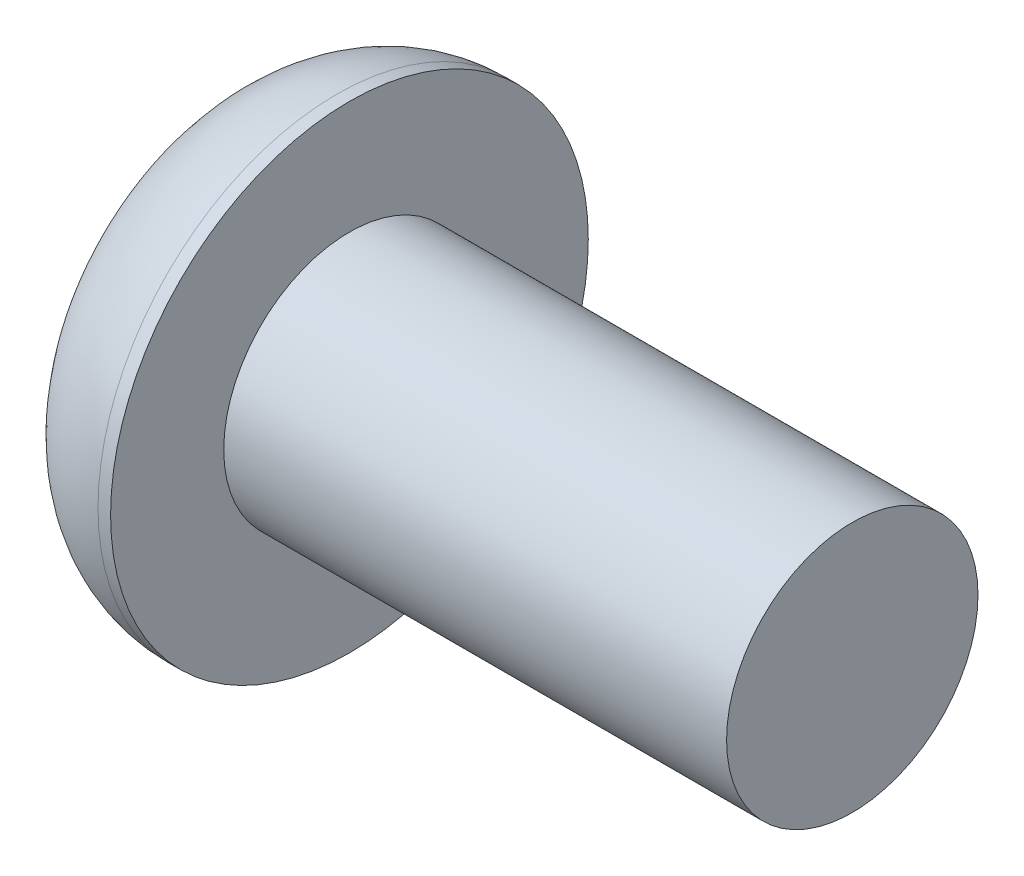
ISO-10303-21;
HEADER;
FILE_DESCRIPTION(('STEP AP214'),'2;1');
FILE_NAME('part.step','',(''),(''),'','','');
FILE_SCHEMA(('AUTOMOTIVE_DESIGN { 1 0 10303 214 1 1 1 1 }'));
ENDSEC;
DATA;
#1=APPLICATION_CONTEXT('core data for automotive mechanical design processes');
#2=APPLICATION_PROTOCOL_DEFINITION('international standard','automotive_design',2000,#1);
#3=PRODUCT_CONTEXT('',#1,'mechanical');
#4=PRODUCT('Part','Part','',(#3));
#5=PRODUCT_RELATED_PRODUCT_CATEGORY('part','',(#4));
#6=PRODUCT_DEFINITION_FORMATION('','',#4);
#7=PRODUCT_DEFINITION_CONTEXT('part definition',#1,'design');
#8=PRODUCT_DEFINITION('design','',#6,#7);
#9=PRODUCT_DEFINITION_SHAPE('','',#8);
#10=(LENGTH_UNIT() NAMED_UNIT(*) SI_UNIT(.MILLI.,.METRE.));
#11=(NAMED_UNIT(*) PLANE_ANGLE_UNIT() SI_UNIT($,.RADIAN.));
#12=(NAMED_UNIT(*) SI_UNIT($,.STERADIAN.) SOLID_ANGLE_UNIT());
#13=UNCERTAINTY_MEASURE_WITH_UNIT(LENGTH_MEASURE(1.E-05),#10,'distance_accuracy_value','');
#14=(GEOMETRIC_REPRESENTATION_CONTEXT(3) GLOBAL_UNCERTAINTY_ASSIGNED_CONTEXT((#13)) GLOBAL_UNIT_ASSIGNED_CONTEXT((#10,
#11,#12)) REPRESENTATION_CONTEXT('',''));
#15=CARTESIAN_POINT('',(0.,0.,0.));
#16=DIRECTION('',(0.,0.,1.));
#17=DIRECTION('',(1.,0.,0.));
#18=AXIS2_PLACEMENT_3D('',#15,#16,#17);
#19=CARTESIAN_POINT('',(0.,0.,-1.34999999999999));
#20=DIRECTION('',(-1.,0.,0.));
#21=DIRECTION('',(0.,0.,1.));
#22=AXIS2_PLACEMENT_3D('',#19,#20,#21);
#23=PLANE('',#22);
#24=DIRECTION('',(0.,0.866025403784439,0.5));
#25=VECTOR('',#24,1.);
#26=CARTESIAN_POINT('',(0.,-1.,0.577350269189626));
#27=LINE('',#26,#25);
#28=CARTESIAN_POINT('',(0.,-1.,0.577350269189626));
#29=VERTEX_POINT('',#28);
#30=CARTESIAN_POINT('',(0.,0.,1.15470053837925));
#31=VERTEX_POINT('',#30);
#32=EDGE_CURVE('E47',#29,#31,#27,.T.);
#33=ORIENTED_EDGE('',*,*,#32,.F.);
#34=DIRECTION('',(0.,0.,1.));
#35=VECTOR('',#34,1.);
#36=CARTESIAN_POINT('',(0.,-1.,-0.577350269189626));
#37=LINE('',#36,#35);
#38=CARTESIAN_POINT('',(0.,-1.,-0.577350269189626));
#39=VERTEX_POINT('',#38);
#40=EDGE_CURVE('E130',#39,#29,#37,.T.);
#41=ORIENTED_EDGE('',*,*,#40,.F.);
#42=DIRECTION('',(0.,-0.866025403784439,0.5));
#43=VECTOR('',#42,1.);
#44=CARTESIAN_POINT('',(0.,0.,-1.15470053837925));
#45=LINE('',#44,#43);
#46=CARTESIAN_POINT('',(0.,0.,-1.15470053837925));
#47=VERTEX_POINT('',#46);
#48=EDGE_CURVE('E128',#47,#39,#45,.T.);
#49=ORIENTED_EDGE('',*,*,#48,.F.);
#50=DIRECTION('',(0.,-0.866025403784439,-0.5));
#51=VECTOR('',#50,1.);
#52=CARTESIAN_POINT('',(0.,1.,-0.577350269189626));
#53=LINE('',#52,#51);
#54=CARTESIAN_POINT('',(0.,1.,-0.577350269189626));
#55=VERTEX_POINT('',#54);
#56=EDGE_CURVE('E95',#55,#47,#53,.T.);
#57=ORIENTED_EDGE('',*,*,#56,.F.);
#58=DIRECTION('',(0.,0.,-1.));
#59=VECTOR('',#58,1.);
#60=CARTESIAN_POINT('',(0.,1.,0.577350269189625));
#61=LINE('',#60,#59);
#62=CARTESIAN_POINT('',(0.,1.,0.577350269189625));
#63=VERTEX_POINT('',#62);
#64=EDGE_CURVE('E124',#63,#55,#61,.T.);
#65=ORIENTED_EDGE('',*,*,#64,.F.);
#66=DIRECTION('',(0.,0.866025403784439,-0.5));
#67=VECTOR('',#66,1.);
#68=CARTESIAN_POINT('',(0.,0.,1.15470053837925));
#69=LINE('',#68,#67);
#70=EDGE_CURVE('E121',#31,#63,#69,.T.);
#71=ORIENTED_EDGE('',*,*,#70,.F.);
#72=EDGE_LOOP('',(#33,#41,#49,#57,#65,#71));
#73=FACE_BOUND('',#72,.T.);
#74=CARTESIAN_POINT('',(0.,0.,0.));
#75=DIRECTION('',(1.,0.,0.));
#76=DIRECTION('',(0.,0.,-1.));
#77=AXIS2_PLACEMENT_3D('',#74,#75,#76);
#78=CIRCLE('',#77,1.34999999999999);
#79=CARTESIAN_POINT('',(0.,0.,-1.34999999999999));
#80=VERTEX_POINT('',#79);
#81=EDGE_CURVE('E11',#80,#80,#78,.T.);
#82=ORIENTED_EDGE('',*,*,#81,.F.);
#83=EDGE_LOOP('',(#82));
#84=FACE_BOUND('',#83,.T.);
#85=ADVANCED_FACE('F33',(#73,#84),#23,.T.);
#86=CARTESIAN_POINT('',(1.5,0.,0.));
#87=DIRECTION('',(1.,0.,0.));
#88=DIRECTION('',(0.,0.,-1.));
#89=AXIS2_PLACEMENT_3D('',#86,#87,#88);
#90=DEGENERATE_TOROIDAL_SURFACE('',#89,1.35,1.5,.T.);
#91=ORIENTED_EDGE('',*,*,#81,.T.);
#92=EDGE_LOOP('',(#91));
#93=FACE_BOUND('',#92,.T.);
#94=CARTESIAN_POINT('',(1.50000000000001,0.,0.));
#95=DIRECTION('',(1.,0.,0.));
#96=DIRECTION('',(0.,0.,-1.));
#97=AXIS2_PLACEMENT_3D('',#94,#95,#96);
#98=CIRCLE('',#97,2.85);
#99=CARTESIAN_POINT('',(1.50000000000001,0.,-2.85));
#100=VERTEX_POINT('',#99);
#101=EDGE_CURVE('E40',#100,#100,#98,.T.);
#102=ORIENTED_EDGE('',*,*,#101,.F.);
#103=EDGE_LOOP('',(#102));
#104=FACE_BOUND('',#103,.T.);
#105=ADVANCED_FACE('F153',(#93,#104),#90,.T.);
#106=CARTESIAN_POINT('',(0.,0.,0.));
#107=DIRECTION('',(1.,0.,0.));
#108=DIRECTION('',(0.,0.,-1.));
#109=AXIS2_PLACEMENT_3D('',#106,#107,#108);
#110=CYLINDRICAL_SURFACE('',#109,2.85);
#111=ORIENTED_EDGE('',*,*,#101,.T.);
#112=EDGE_LOOP('',(#111));
#113=FACE_BOUND('',#112,.T.);
#114=CARTESIAN_POINT('',(1.65,0.,0.));
#115=DIRECTION('',(1.,0.,0.));
#116=DIRECTION('',(0.,0.,-1.));
#117=AXIS2_PLACEMENT_3D('',#114,#115,#116);
#118=CIRCLE('',#117,2.85);
#119=CARTESIAN_POINT('',(1.65,0.,-2.85));
#120=VERTEX_POINT('',#119);
#121=EDGE_CURVE('E145',#120,#120,#118,.T.);
#122=ORIENTED_EDGE('',*,*,#121,.F.);
#123=EDGE_LOOP('',(#122));
#124=FACE_BOUND('',#123,.T.);
#125=ADVANCED_FACE('F150',(#113,#124),#110,.T.);
#126=CARTESIAN_POINT('',(1.65,0.,-1.5));
#127=DIRECTION('',(1.,0.,0.));
#128=DIRECTION('',(0.,0.,-1.));
#129=AXIS2_PLACEMENT_3D('',#126,#127,#128);
#130=PLANE('',#129);
#131=ORIENTED_EDGE('',*,*,#121,.T.);
#132=EDGE_LOOP('',(#131));
#133=FACE_BOUND('',#132,.T.);
#134=CARTESIAN_POINT('',(1.65,0.,0.));
#135=DIRECTION('',(1.,0.,0.));
#136=DIRECTION('',(0.,0.,-1.));
#137=AXIS2_PLACEMENT_3D('',#134,#135,#136);
#138=CIRCLE('',#137,1.5);
#139=CARTESIAN_POINT('',(1.65,0.,-1.5));
#140=VERTEX_POINT('',#139);
#141=EDGE_CURVE('E142',#140,#140,#138,.T.);
#142=ORIENTED_EDGE('',*,*,#141,.F.);
#143=EDGE_LOOP('',(#142));
#144=FACE_BOUND('',#143,.T.);
#145=ADVANCED_FACE('F160',(#133,#144),#130,.T.);
#146=CARTESIAN_POINT('',(0.,0.,0.));
#147=DIRECTION('',(1.,0.,0.));
#148=DIRECTION('',(0.,0.,-1.));
#149=AXIS2_PLACEMENT_3D('',#146,#147,#148);
#150=CYLINDRICAL_SURFACE('',#149,1.5);
#151=ORIENTED_EDGE('',*,*,#141,.T.);
#152=EDGE_LOOP('',(#151));
#153=FACE_BOUND('',#152,.T.);
#154=CARTESIAN_POINT('',(7.65,0.,0.));
#155=DIRECTION('',(1.,0.,0.));
#156=DIRECTION('',(0.,0.,-1.));
#157=AXIS2_PLACEMENT_3D('',#154,#155,#156);
#158=CIRCLE('',#157,1.5);
#159=CARTESIAN_POINT('',(7.65,0.,-1.5));
#160=VERTEX_POINT('',#159);
#161=EDGE_CURVE('E134',#160,#160,#158,.T.);
#162=ORIENTED_EDGE('',*,*,#161,.F.);
#163=EDGE_LOOP('',(#162));
#164=FACE_BOUND('',#163,.T.);
#165=ADVANCED_FACE('F166',(#153,#164),#150,.T.);
#166=CARTESIAN_POINT('',(7.65,0.,0.));
#167=DIRECTION('',(1.,0.,0.));
#168=DIRECTION('',(0.,0.,-1.));
#169=AXIS2_PLACEMENT_3D('',#166,#167,#168);
#170=PLANE('',#169);
#171=ORIENTED_EDGE('',*,*,#161,.T.);
#172=EDGE_LOOP('',(#171));
#173=FACE_BOUND('',#172,.T.);
#174=ADVANCED_FACE('F170',(#173),#170,.T.);
#175=CARTESIAN_POINT('',(1.04,-1.,0.577350269189626));
#176=DIRECTION('',(0.,-0.5,0.866025403784439));
#177=DIRECTION('',(0.,-0.866025403784439,-0.5));
#178=AXIS2_PLACEMENT_3D('',#175,#176,#177);
#179=PLANE('',#178);
#180=ORIENTED_EDGE('',*,*,#32,.T.);
#181=DIRECTION('',(-1.,0.,0.));
#182=VECTOR('',#181,1.);
#183=CARTESIAN_POINT('',(1.04,0.,1.15470053837925));
#184=LINE('',#183,#182);
#185=CARTESIAN_POINT('',(1.04,0.,1.15470053837925));
#186=VERTEX_POINT('',#185);
#187=EDGE_CURVE('E77',#186,#31,#184,.T.);
#188=ORIENTED_EDGE('',*,*,#187,.F.);
#189=DIRECTION('',(0.,0.866025403784439,0.5));
#190=VECTOR('',#189,1.);
#191=CARTESIAN_POINT('',(1.04,-1.,0.577350269189626));
#192=LINE('',#191,#190);
#193=CARTESIAN_POINT('',(1.04,-1.,0.577350269189626));
#194=VERTEX_POINT('',#193);
#195=EDGE_CURVE('E132',#194,#186,#192,.T.);
#196=ORIENTED_EDGE('',*,*,#195,.F.);
#197=DIRECTION('',(-1.,0.,0.));
#198=VECTOR('',#197,1.);
#199=CARTESIAN_POINT('',(1.04,-1.,0.577350269189626));
#200=LINE('',#199,#198);
#201=EDGE_CURVE('E55',#194,#29,#200,.T.);
#202=ORIENTED_EDGE('',*,*,#201,.T.);
#203=EDGE_LOOP('',(#180,#188,#196,#202));
#204=FACE_BOUND('',#203,.T.);
#205=ADVANCED_FACE('F174',(#204),#179,.F.);
#206=CARTESIAN_POINT('',(1.04,-1.,-0.577350269189626));
#207=DIRECTION('',(0.,-1.,0.));
#208=DIRECTION('',(0.,0.,-1.));
#209=AXIS2_PLACEMENT_3D('',#206,#207,#208);
#210=PLANE('',#209);
#211=ORIENTED_EDGE('',*,*,#40,.T.);
#212=ORIENTED_EDGE('',*,*,#201,.F.);
#213=DIRECTION('',(0.,0.,1.));
#214=VECTOR('',#213,1.);
#215=CARTESIAN_POINT('',(1.04,-1.,-0.577350269189626));
#216=LINE('',#215,#214);
#217=CARTESIAN_POINT('',(1.04,-1.,-0.577350269189626));
#218=VERTEX_POINT('',#217);
#219=EDGE_CURVE('E107',#218,#194,#216,.T.);
#220=ORIENTED_EDGE('',*,*,#219,.F.);
#221=DIRECTION('',(-1.,0.,0.));
#222=VECTOR('',#221,1.);
#223=CARTESIAN_POINT('',(1.04,-1.,-0.577350269189626));
#224=LINE('',#223,#222);
#225=EDGE_CURVE('E99',#218,#39,#224,.T.);
#226=ORIENTED_EDGE('',*,*,#225,.T.);
#227=EDGE_LOOP('',(#211,#212,#220,#226));
#228=FACE_BOUND('',#227,.T.);
#229=ADVANCED_FACE('F178',(#228),#210,.F.);
#230=CARTESIAN_POINT('',(1.04,0.,-1.15470053837925));
#231=DIRECTION('',(0.,-0.5,-0.866025403784439));
#232=DIRECTION('',(0.,0.866025403784439,-0.5));
#233=AXIS2_PLACEMENT_3D('',#230,#231,#232);
#234=PLANE('',#233);
#235=ORIENTED_EDGE('',*,*,#48,.T.);
#236=ORIENTED_EDGE('',*,*,#225,.F.);
#237=DIRECTION('',(0.,-0.866025403784439,0.5));
#238=VECTOR('',#237,1.);
#239=CARTESIAN_POINT('',(1.04,0.,-1.15470053837925));
#240=LINE('',#239,#238);
#241=CARTESIAN_POINT('',(1.04,0.,-1.15470053837925));
#242=VERTEX_POINT('',#241);
#243=EDGE_CURVE('E103',#242,#218,#240,.T.);
#244=ORIENTED_EDGE('',*,*,#243,.F.);
#245=DIRECTION('',(-1.,0.,0.));
#246=VECTOR('',#245,1.);
#247=CARTESIAN_POINT('',(1.04,0.,-1.15470053837925));
#248=LINE('',#247,#246);
#249=EDGE_CURVE('E88',#242,#47,#248,.T.);
#250=ORIENTED_EDGE('',*,*,#249,.T.);
#251=EDGE_LOOP('',(#235,#236,#244,#250));
#252=FACE_BOUND('',#251,.T.);
#253=ADVANCED_FACE('F104',(#252),#234,.F.);
#254=CARTESIAN_POINT('',(1.04,1.,-0.577350269189626));
#255=DIRECTION('',(0.,0.5,-0.866025403784439));
#256=DIRECTION('',(0.,0.866025403784439,0.5));
#257=AXIS2_PLACEMENT_3D('',#254,#255,#256);
#258=PLANE('',#257);
#259=ORIENTED_EDGE('',*,*,#56,.T.);
#260=ORIENTED_EDGE('',*,*,#249,.F.);
#261=DIRECTION('',(0.,-0.866025403784439,-0.5));
#262=VECTOR('',#261,1.);
#263=CARTESIAN_POINT('',(1.04,1.,-0.577350269189626));
#264=LINE('',#263,#262);
#265=CARTESIAN_POINT('',(1.04,1.,-0.577350269189626));
#266=VERTEX_POINT('',#265);
#267=EDGE_CURVE('E92',#266,#242,#264,.T.);
#268=ORIENTED_EDGE('',*,*,#267,.F.);
#269=DIRECTION('',(-1.,0.,0.));
#270=VECTOR('',#269,1.);
#271=CARTESIAN_POINT('',(1.04,1.,-0.577350269189626));
#272=LINE('',#271,#270);
#273=EDGE_CURVE('E100',#266,#55,#272,.T.);
#274=ORIENTED_EDGE('',*,*,#273,.T.);
#275=EDGE_LOOP('',(#259,#260,#268,#274));
#276=FACE_BOUND('',#275,.T.);
#277=ADVANCED_FACE('F90',(#276),#258,.F.);
#278=CARTESIAN_POINT('',(1.04,1.,0.577350269189625));
#279=DIRECTION('',(0.,1.,0.));
#280=DIRECTION('',(0.,0.,1.));
#281=AXIS2_PLACEMENT_3D('',#278,#279,#280);
#282=PLANE('',#281);
#283=ORIENTED_EDGE('',*,*,#64,.T.);
#284=ORIENTED_EDGE('',*,*,#273,.F.);
#285=DIRECTION('',(0.,0.,-1.));
#286=VECTOR('',#285,1.);
#287=CARTESIAN_POINT('',(1.04,1.,0.577350269189625));
#288=LINE('',#287,#286);
#289=CARTESIAN_POINT('',(1.04,1.,0.577350269189625));
#290=VERTEX_POINT('',#289);
#291=EDGE_CURVE('E113',#290,#266,#288,.T.);
#292=ORIENTED_EDGE('',*,*,#291,.F.);
#293=DIRECTION('',(-1.,0.,0.));
#294=VECTOR('',#293,1.);
#295=CARTESIAN_POINT('',(1.04,1.,0.577350269189625));
#296=LINE('',#295,#294);
#297=EDGE_CURVE('E137',#290,#63,#296,.T.);
#298=ORIENTED_EDGE('',*,*,#297,.T.);
#299=EDGE_LOOP('',(#283,#284,#292,#298));
#300=FACE_BOUND('',#299,.T.);
#301=ADVANCED_FACE('F182',(#300),#282,.F.);
#302=CARTESIAN_POINT('',(1.04,0.,1.15470053837925));
#303=DIRECTION('',(0.,0.5,0.866025403784439));
#304=DIRECTION('',(0.,-0.866025403784439,0.5));
#305=AXIS2_PLACEMENT_3D('',#302,#303,#304);
#306=PLANE('',#305);
#307=ORIENTED_EDGE('',*,*,#70,.T.);
#308=ORIENTED_EDGE('',*,*,#297,.F.);
#309=DIRECTION('',(0.,0.866025403784439,-0.5));
#310=VECTOR('',#309,1.);
#311=CARTESIAN_POINT('',(1.04,0.,1.15470053837925));
#312=LINE('',#311,#310);
#313=EDGE_CURVE('E115',#186,#290,#312,.T.);
#314=ORIENTED_EDGE('',*,*,#313,.F.);
#315=ORIENTED_EDGE('',*,*,#187,.T.);
#316=EDGE_LOOP('',(#307,#308,#314,#315));
#317=FACE_BOUND('',#316,.T.);
#318=ADVANCED_FACE('F179',(#317),#306,.F.);
#319=CARTESIAN_POINT('',(1.04,0.,0.));
#320=DIRECTION('',(-1.,0.,0.));
#321=DIRECTION('',(0.,0.,1.));
#322=AXIS2_PLACEMENT_3D('',#319,#320,#321);
#323=PLANE('',#322);
#324=ORIENTED_EDGE('',*,*,#195,.T.);
#325=ORIENTED_EDGE('',*,*,#313,.T.);
#326=ORIENTED_EDGE('',*,*,#291,.T.);
#327=ORIENTED_EDGE('',*,*,#267,.T.);
#328=ORIENTED_EDGE('',*,*,#243,.T.);
#329=ORIENTED_EDGE('',*,*,#219,.T.);
#330=EDGE_LOOP('',(#324,#325,#326,#327,#328,#329));
#331=FACE_BOUND('',#330,.T.);
#332=ADVANCED_FACE('F110',(#331),#323,.T.);
#333=CLOSED_SHELL('',(#85,#105,#125,#145,#165,#174,#205,#229,#253,#277,#301,#318,#332));
#334=MANIFOLD_SOLID_BREP('B2',#333);
#335=ADVANCED_BREP_SHAPE_REPRESENTATION('',(#18,#334),#14);
#336=SHAPE_DEFINITION_REPRESENTATION(#9,#335);
ENDSEC;
END-ISO-10303-21;
